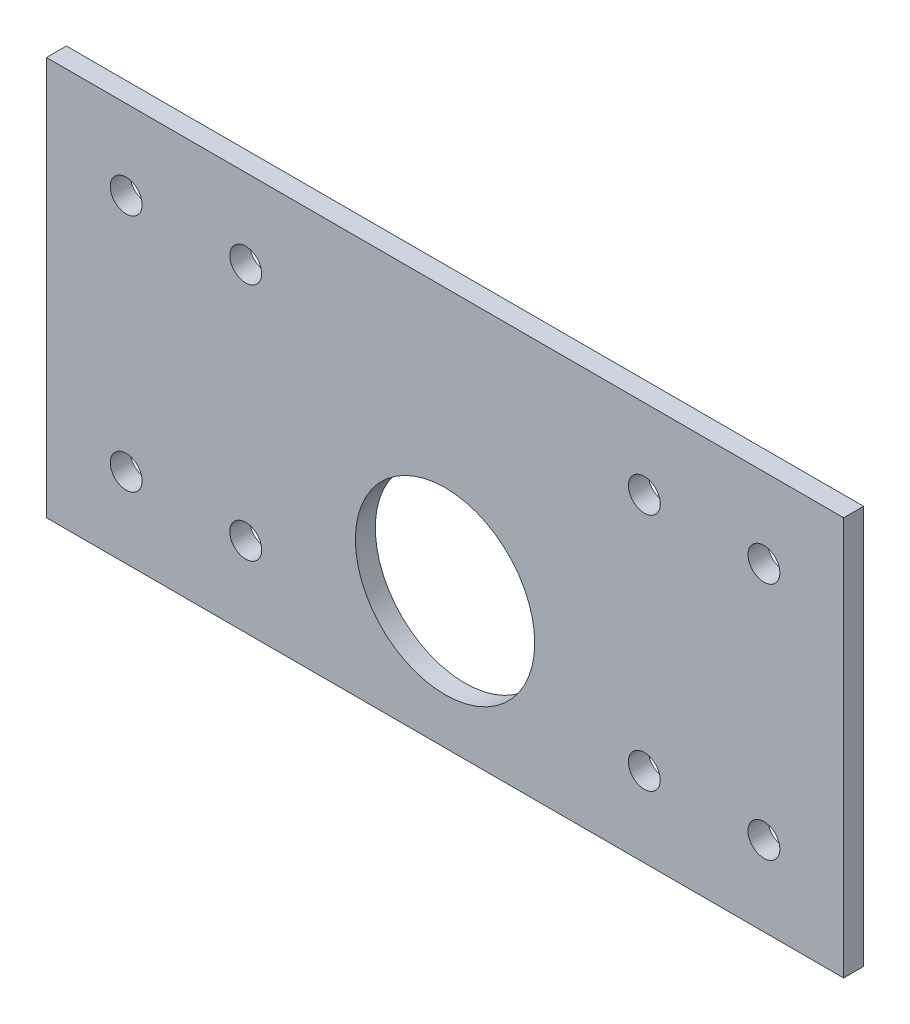
ISO-10303-21;
HEADER;
FILE_DESCRIPTION(('STEP AP214'),'2;1');
FILE_NAME('part.step','',(''),(''),'','','');
FILE_SCHEMA(('AUTOMOTIVE_DESIGN { 1 0 10303 214 1 1 1 1 }'));
ENDSEC;
DATA;
#1=APPLICATION_CONTEXT('core data for automotive mechanical design processes');
#2=APPLICATION_PROTOCOL_DEFINITION('international standard','automotive_design',2000,#1);
#3=PRODUCT_CONTEXT('',#1,'mechanical');
#4=PRODUCT('Part','Part','',(#3));
#5=PRODUCT_RELATED_PRODUCT_CATEGORY('part','',(#4));
#6=PRODUCT_DEFINITION_FORMATION('','',#4);
#7=PRODUCT_DEFINITION_CONTEXT('part definition',#1,'design');
#8=PRODUCT_DEFINITION('design','',#6,#7);
#9=PRODUCT_DEFINITION_SHAPE('','',#8);
#10=(LENGTH_UNIT() NAMED_UNIT(*) SI_UNIT(.MILLI.,.METRE.));
#11=(NAMED_UNIT(*) PLANE_ANGLE_UNIT() SI_UNIT($,.RADIAN.));
#12=(NAMED_UNIT(*) SI_UNIT($,.STERADIAN.) SOLID_ANGLE_UNIT());
#13=UNCERTAINTY_MEASURE_WITH_UNIT(LENGTH_MEASURE(1.E-05),#10,'distance_accuracy_value','');
#14=(GEOMETRIC_REPRESENTATION_CONTEXT(3) GLOBAL_UNCERTAINTY_ASSIGNED_CONTEXT((#13)) GLOBAL_UNIT_ASSIGNED_CONTEXT((#10,
#11,#12)) REPRESENTATION_CONTEXT('',''));
#15=CARTESIAN_POINT('',(0.,0.,0.));
#16=DIRECTION('',(0.,0.,1.));
#17=DIRECTION('',(1.,0.,0.));
#18=AXIS2_PLACEMENT_3D('',#15,#16,#17);
#19=CARTESIAN_POINT('',(63.5,-31.75,1.5875));
#20=DIRECTION('',(-1.,0.,0.));
#21=DIRECTION('',(0.,0.,1.));
#22=AXIS2_PLACEMENT_3D('',#19,#20,#21);
#23=PLANE('',#22);
#24=DIRECTION('',(0.,1.,0.));
#25=VECTOR('',#24,1.);
#26=CARTESIAN_POINT('',(63.5,-31.75,-1.5875));
#27=LINE('',#26,#25);
#28=CARTESIAN_POINT('',(63.5,-31.75,-1.5875));
#29=VERTEX_POINT('',#28);
#30=CARTESIAN_POINT('',(63.5,31.75,-1.5875));
#31=VERTEX_POINT('',#30);
#32=EDGE_CURVE('E115',#29,#31,#27,.T.);
#33=ORIENTED_EDGE('',*,*,#32,.T.);
#34=DIRECTION('',(0.,0.,-1.));
#35=VECTOR('',#34,1.);
#36=CARTESIAN_POINT('',(63.5,31.75,1.5875));
#37=LINE('',#36,#35);
#38=CARTESIAN_POINT('',(63.5,31.75,1.5875));
#39=VERTEX_POINT('',#38);
#40=EDGE_CURVE('E11',#39,#31,#37,.T.);
#41=ORIENTED_EDGE('',*,*,#40,.F.);
#42=DIRECTION('',(0.,1.,0.));
#43=VECTOR('',#42,1.);
#44=CARTESIAN_POINT('',(63.5,-31.75,1.5875));
#45=LINE('',#44,#43);
#46=CARTESIAN_POINT('',(63.5,-31.75,1.5875));
#47=VERTEX_POINT('',#46);
#48=EDGE_CURVE('E98',#47,#39,#45,.T.);
#49=ORIENTED_EDGE('',*,*,#48,.F.);
#50=DIRECTION('',(0.,0.,-1.));
#51=VECTOR('',#50,1.);
#52=CARTESIAN_POINT('',(63.5,-31.75,1.5875));
#53=LINE('',#52,#51);
#54=EDGE_CURVE('E111',#47,#29,#53,.T.);
#55=ORIENTED_EDGE('',*,*,#54,.T.);
#56=EDGE_LOOP('',(#33,#41,#49,#55));
#57=FACE_BOUND('',#56,.T.);
#58=ADVANCED_FACE('F43',(#57),#23,.F.);
#59=CARTESIAN_POINT('',(-63.5,31.75,1.5875));
#60=DIRECTION('',(0.,-1.,0.));
#61=DIRECTION('',(0.,0.,-1.));
#62=AXIS2_PLACEMENT_3D('',#59,#60,#61);
#63=PLANE('',#62);
#64=DIRECTION('',(-1.,0.,0.));
#65=VECTOR('',#64,1.);
#66=CARTESIAN_POINT('',(-63.5,31.75,-1.5875));
#67=LINE('',#66,#65);
#68=CARTESIAN_POINT('',(-63.5,31.75,-1.5875));
#69=VERTEX_POINT('',#68);
#70=EDGE_CURVE('E103',#31,#69,#67,.T.);
#71=ORIENTED_EDGE('',*,*,#70,.T.);
#72=DIRECTION('',(0.,0.,-1.));
#73=VECTOR('',#72,1.);
#74=CARTESIAN_POINT('',(-63.5,31.75,1.5875));
#75=LINE('',#74,#73);
#76=CARTESIAN_POINT('',(-63.5,31.75,1.5875));
#77=VERTEX_POINT('',#76);
#78=EDGE_CURVE('E51',#77,#69,#75,.T.);
#79=ORIENTED_EDGE('',*,*,#78,.F.);
#80=DIRECTION('',(-1.,0.,0.));
#81=VECTOR('',#80,1.);
#82=CARTESIAN_POINT('',(-63.5,31.75,1.5875));
#83=LINE('',#82,#81);
#84=EDGE_CURVE('E93',#39,#77,#83,.T.);
#85=ORIENTED_EDGE('',*,*,#84,.F.);
#86=ORIENTED_EDGE('',*,*,#40,.T.);
#87=EDGE_LOOP('',(#71,#79,#85,#86));
#88=FACE_BOUND('',#87,.T.);
#89=ADVANCED_FACE('F102',(#88),#63,.F.);
#90=CARTESIAN_POINT('',(-63.5,-31.75,1.5875));
#91=DIRECTION('',(1.,0.,0.));
#92=DIRECTION('',(0.,0.,-1.));
#93=AXIS2_PLACEMENT_3D('',#90,#91,#92);
#94=PLANE('',#93);
#95=DIRECTION('',(0.,-1.,0.));
#96=VECTOR('',#95,1.);
#97=CARTESIAN_POINT('',(-63.5,-31.75,-1.5875));
#98=LINE('',#97,#96);
#99=CARTESIAN_POINT('',(-63.5,-31.75,-1.5875));
#100=VERTEX_POINT('',#99);
#101=EDGE_CURVE('E80',#69,#100,#98,.T.);
#102=ORIENTED_EDGE('',*,*,#101,.T.);
#103=DIRECTION('',(0.,0.,-1.));
#104=VECTOR('',#103,1.);
#105=CARTESIAN_POINT('',(-63.5,-31.75,1.5875));
#106=LINE('',#105,#104);
#107=CARTESIAN_POINT('',(-63.5,-31.75,1.5875));
#108=VERTEX_POINT('',#107);
#109=EDGE_CURVE('E104',#108,#100,#106,.T.);
#110=ORIENTED_EDGE('',*,*,#109,.F.);
#111=DIRECTION('',(0.,-1.,0.));
#112=VECTOR('',#111,1.);
#113=CARTESIAN_POINT('',(-63.5,-31.75,1.5875));
#114=LINE('',#113,#112);
#115=EDGE_CURVE('E96',#77,#108,#114,.T.);
#116=ORIENTED_EDGE('',*,*,#115,.F.);
#117=ORIENTED_EDGE('',*,*,#78,.T.);
#118=EDGE_LOOP('',(#102,#110,#116,#117));
#119=FACE_BOUND('',#118,.T.);
#120=ADVANCED_FACE('F105',(#119),#94,.F.);
#121=CARTESIAN_POINT('',(-63.5,-31.75,1.5875));
#122=DIRECTION('',(0.,1.,0.));
#123=DIRECTION('',(0.,0.,1.));
#124=AXIS2_PLACEMENT_3D('',#121,#122,#123);
#125=PLANE('',#124);
#126=DIRECTION('',(1.,0.,0.));
#127=VECTOR('',#126,1.);
#128=CARTESIAN_POINT('',(-63.5,-31.75,-1.5875));
#129=LINE('',#128,#127);
#130=EDGE_CURVE('E86',#100,#29,#129,.T.);
#131=ORIENTED_EDGE('',*,*,#130,.T.);
#132=ORIENTED_EDGE('',*,*,#54,.F.);
#133=DIRECTION('',(1.,0.,0.));
#134=VECTOR('',#133,1.);
#135=CARTESIAN_POINT('',(-63.5,-31.75,1.5875));
#136=LINE('',#135,#134);
#137=EDGE_CURVE('E62',#108,#47,#136,.T.);
#138=ORIENTED_EDGE('',*,*,#137,.F.);
#139=ORIENTED_EDGE('',*,*,#109,.T.);
#140=EDGE_LOOP('',(#131,#132,#138,#139));
#141=FACE_BOUND('',#140,.T.);
#142=ADVANCED_FACE('F130',(#141),#125,.F.);
#143=CARTESIAN_POINT('',(0.,0.,1.5875));
#144=DIRECTION('',(0.,0.,-1.));
#145=DIRECTION('',(-1.,0.,0.));
#146=AXIS2_PLACEMENT_3D('',#143,#144,#145);
#147=PLANE('',#146);
#148=CARTESIAN_POINT('',(-31.75,-19.05,1.5875));
#149=DIRECTION('',(0.,0.,1.));
#150=DIRECTION('',(1.,0.,0.));
#151=AXIS2_PLACEMENT_3D('',#148,#149,#150);
#152=CIRCLE('',#151,2.54000000000003);
#153=CARTESIAN_POINT('',(-29.21,-19.05,1.5875));
#154=VERTEX_POINT('',#153);
#155=EDGE_CURVE('E182',#154,#154,#152,.T.);
#156=ORIENTED_EDGE('',*,*,#155,.F.);
#157=EDGE_LOOP('',(#156));
#158=FACE_BOUND('',#157,.T.);
#159=CARTESIAN_POINT('',(31.75,19.05,1.5875));
#160=DIRECTION('',(0.,0.,1.));
#161=DIRECTION('',(1.,0.,0.));
#162=AXIS2_PLACEMENT_3D('',#159,#160,#161);
#163=CIRCLE('',#162,2.54);
#164=CARTESIAN_POINT('',(34.29,19.05,1.5875));
#165=VERTEX_POINT('',#164);
#166=EDGE_CURVE('E183',#165,#165,#163,.T.);
#167=ORIENTED_EDGE('',*,*,#166,.F.);
#168=EDGE_LOOP('',(#167));
#169=FACE_BOUND('',#168,.T.);
#170=CARTESIAN_POINT('',(31.75,-19.05,1.5875));
#171=DIRECTION('',(0.,0.,1.));
#172=DIRECTION('',(1.,0.,0.));
#173=AXIS2_PLACEMENT_3D('',#170,#171,#172);
#174=CIRCLE('',#173,2.54000000000002);
#175=CARTESIAN_POINT('',(34.29,-19.05,1.5875));
#176=VERTEX_POINT('',#175);
#177=EDGE_CURVE('E197',#176,#176,#174,.T.);
#178=ORIENTED_EDGE('',*,*,#177,.F.);
#179=EDGE_LOOP('',(#178));
#180=FACE_BOUND('',#179,.T.);
#181=CARTESIAN_POINT('',(-31.75,19.05,1.5875));
#182=DIRECTION('',(0.,0.,1.));
#183=DIRECTION('',(1.,0.,0.));
#184=AXIS2_PLACEMENT_3D('',#181,#182,#183);
#185=CIRCLE('',#184,2.54);
#186=CARTESIAN_POINT('',(-29.21,19.05,1.5875));
#187=VERTEX_POINT('',#186);
#188=EDGE_CURVE('E174',#187,#187,#185,.T.);
#189=ORIENTED_EDGE('',*,*,#188,.F.);
#190=EDGE_LOOP('',(#189));
#191=FACE_BOUND('',#190,.T.);
#192=CARTESIAN_POINT('',(50.8,19.05,1.5875));
#193=DIRECTION('',(0.,0.,1.));
#194=DIRECTION('',(1.,0.,0.));
#195=AXIS2_PLACEMENT_3D('',#192,#193,#194);
#196=CIRCLE('',#195,2.54);
#197=CARTESIAN_POINT('',(53.34,19.05,1.5875));
#198=VERTEX_POINT('',#197);
#199=EDGE_CURVE('E154',#198,#198,#196,.T.);
#200=ORIENTED_EDGE('',*,*,#199,.F.);
#201=EDGE_LOOP('',(#200));
#202=FACE_BOUND('',#201,.T.);
#203=CARTESIAN_POINT('',(50.8,-19.05,1.5875));
#204=DIRECTION('',(0.,0.,1.));
#205=DIRECTION('',(1.,0.,0.));
#206=AXIS2_PLACEMENT_3D('',#203,#204,#205);
#207=CIRCLE('',#206,2.54000000000003);
#208=CARTESIAN_POINT('',(53.34,-19.05,1.5875));
#209=VERTEX_POINT('',#208);
#210=EDGE_CURVE('E153',#209,#209,#207,.T.);
#211=ORIENTED_EDGE('',*,*,#210,.F.);
#212=EDGE_LOOP('',(#211));
#213=FACE_BOUND('',#212,.T.);
#214=CARTESIAN_POINT('',(-50.8,-19.05,1.5875));
#215=DIRECTION('',(0.,0.,1.));
#216=DIRECTION('',(1.,0.,0.));
#217=AXIS2_PLACEMENT_3D('',#214,#215,#216);
#218=CIRCLE('',#217,2.54000000000004);
#219=CARTESIAN_POINT('',(-48.26,-19.05,1.5875));
#220=VERTEX_POINT('',#219);
#221=EDGE_CURVE('E161',#220,#220,#218,.T.);
#222=ORIENTED_EDGE('',*,*,#221,.F.);
#223=EDGE_LOOP('',(#222));
#224=FACE_BOUND('',#223,.T.);
#225=CARTESIAN_POINT('',(-50.8,19.05,1.5875));
#226=DIRECTION('',(0.,0.,1.));
#227=DIRECTION('',(1.,0.,0.));
#228=AXIS2_PLACEMENT_3D('',#225,#226,#227);
#229=CIRCLE('',#228,2.54);
#230=CARTESIAN_POINT('',(-48.26,19.05,1.5875));
#231=VERTEX_POINT('',#230);
#232=EDGE_CURVE('E146',#231,#231,#229,.T.);
#233=ORIENTED_EDGE('',*,*,#232,.F.);
#234=EDGE_LOOP('',(#233));
#235=FACE_BOUND('',#234,.T.);
#236=CARTESIAN_POINT('',(0.,-10.125,1.5875));
#237=DIRECTION('',(0.,0.,-1.));
#238=DIRECTION('',(-1.,0.,0.));
#239=AXIS2_PLACEMENT_3D('',#236,#237,#238);
#240=CIRCLE('',#239,14.2875);
#241=CARTESIAN_POINT('',(-14.2875,-10.125,1.5875));
#242=VERTEX_POINT('',#241);
#243=EDGE_CURVE('E119',#242,#242,#240,.T.);
#244=ORIENTED_EDGE('',*,*,#243,.T.);
#245=EDGE_LOOP('',(#244));
#246=FACE_BOUND('',#245,.T.);
#247=ORIENTED_EDGE('',*,*,#48,.T.);
#248=ORIENTED_EDGE('',*,*,#84,.T.);
#249=ORIENTED_EDGE('',*,*,#115,.T.);
#250=ORIENTED_EDGE('',*,*,#137,.T.);
#251=EDGE_LOOP('',(#247,#248,#249,#250));
#252=FACE_BOUND('',#251,.T.);
#253=ADVANCED_FACE('F94',(#158,#169,#180,#191,#202,#213,#224,#235,#246,#252),#147,.F.);
#254=CARTESIAN_POINT('',(0.,0.,-1.5875));
#255=DIRECTION('',(0.,0.,-1.));
#256=DIRECTION('',(-1.,0.,0.));
#257=AXIS2_PLACEMENT_3D('',#254,#255,#256);
#258=PLANE('',#257);
#259=CARTESIAN_POINT('',(-31.75,-19.05,-1.5875));
#260=DIRECTION('',(0.,0.,1.));
#261=DIRECTION('',(1.,0.,0.));
#262=AXIS2_PLACEMENT_3D('',#259,#260,#261);
#263=CIRCLE('',#262,2.54000000000003);
#264=CARTESIAN_POINT('',(-29.21,-19.05,-1.5875));
#265=VERTEX_POINT('',#264);
#266=EDGE_CURVE('E177',#265,#265,#263,.T.);
#267=ORIENTED_EDGE('',*,*,#266,.T.);
#268=EDGE_LOOP('',(#267));
#269=FACE_BOUND('',#268,.T.);
#270=CARTESIAN_POINT('',(31.75,19.05,-1.5875));
#271=DIRECTION('',(0.,0.,1.));
#272=DIRECTION('',(1.,0.,0.));
#273=AXIS2_PLACEMENT_3D('',#270,#271,#272);
#274=CIRCLE('',#273,2.54);
#275=CARTESIAN_POINT('',(34.29,19.05,-1.5875));
#276=VERTEX_POINT('',#275);
#277=EDGE_CURVE('E178',#276,#276,#274,.T.);
#278=ORIENTED_EDGE('',*,*,#277,.T.);
#279=EDGE_LOOP('',(#278));
#280=FACE_BOUND('',#279,.T.);
#281=CARTESIAN_POINT('',(31.75,-19.05,-1.5875));
#282=DIRECTION('',(0.,0.,1.));
#283=DIRECTION('',(1.,0.,0.));
#284=AXIS2_PLACEMENT_3D('',#281,#282,#283);
#285=CIRCLE('',#284,2.54000000000002);
#286=CARTESIAN_POINT('',(34.29,-19.05,-1.5875));
#287=VERTEX_POINT('',#286);
#288=EDGE_CURVE('E187',#287,#287,#285,.T.);
#289=ORIENTED_EDGE('',*,*,#288,.T.);
#290=EDGE_LOOP('',(#289));
#291=FACE_BOUND('',#290,.T.);
#292=CARTESIAN_POINT('',(-31.75,19.05,-1.5875));
#293=DIRECTION('',(0.,0.,1.));
#294=DIRECTION('',(1.,0.,0.));
#295=AXIS2_PLACEMENT_3D('',#292,#293,#294);
#296=CIRCLE('',#295,2.54);
#297=CARTESIAN_POINT('',(-29.21,19.05,-1.5875));
#298=VERTEX_POINT('',#297);
#299=EDGE_CURVE('E157',#298,#298,#296,.T.);
#300=ORIENTED_EDGE('',*,*,#299,.T.);
#301=EDGE_LOOP('',(#300));
#302=FACE_BOUND('',#301,.T.);
#303=CARTESIAN_POINT('',(50.8,19.05,-1.5875));
#304=DIRECTION('',(0.,0.,1.));
#305=DIRECTION('',(1.,0.,0.));
#306=AXIS2_PLACEMENT_3D('',#303,#304,#305);
#307=CIRCLE('',#306,2.54);
#308=CARTESIAN_POINT('',(53.34,19.05,-1.5875));
#309=VERTEX_POINT('',#308);
#310=EDGE_CURVE('E150',#309,#309,#307,.T.);
#311=ORIENTED_EDGE('',*,*,#310,.T.);
#312=EDGE_LOOP('',(#311));
#313=FACE_BOUND('',#312,.T.);
#314=CARTESIAN_POINT('',(50.8,-19.05,-1.5875));
#315=DIRECTION('',(0.,0.,1.));
#316=DIRECTION('',(1.,0.,0.));
#317=AXIS2_PLACEMENT_3D('',#314,#315,#316);
#318=CIRCLE('',#317,2.54000000000003);
#319=CARTESIAN_POINT('',(53.34,-19.05,-1.5875));
#320=VERTEX_POINT('',#319);
#321=EDGE_CURVE('E158',#320,#320,#318,.T.);
#322=ORIENTED_EDGE('',*,*,#321,.T.);
#323=EDGE_LOOP('',(#322));
#324=FACE_BOUND('',#323,.T.);
#325=CARTESIAN_POINT('',(-50.8,-19.05,-1.5875));
#326=DIRECTION('',(0.,0.,1.));
#327=DIRECTION('',(1.,0.,0.));
#328=AXIS2_PLACEMENT_3D('',#325,#326,#327);
#329=CIRCLE('',#328,2.54000000000004);
#330=CARTESIAN_POINT('',(-48.26,-19.05,-1.5875));
#331=VERTEX_POINT('',#330);
#332=EDGE_CURVE('E149',#331,#331,#329,.T.);
#333=ORIENTED_EDGE('',*,*,#332,.T.);
#334=EDGE_LOOP('',(#333));
#335=FACE_BOUND('',#334,.T.);
#336=CARTESIAN_POINT('',(-50.8,19.05,-1.5875));
#337=DIRECTION('',(0.,0.,1.));
#338=DIRECTION('',(1.,0.,0.));
#339=AXIS2_PLACEMENT_3D('',#336,#337,#338);
#340=CIRCLE('',#339,2.54);
#341=CARTESIAN_POINT('',(-48.26,19.05,-1.5875));
#342=VERTEX_POINT('',#341);
#343=EDGE_CURVE('E143',#342,#342,#340,.T.);
#344=ORIENTED_EDGE('',*,*,#343,.T.);
#345=EDGE_LOOP('',(#344));
#346=FACE_BOUND('',#345,.T.);
#347=CARTESIAN_POINT('',(0.,-10.125,-1.5875));
#348=DIRECTION('',(0.,0.,1.));
#349=DIRECTION('',(1.,0.,0.));
#350=AXIS2_PLACEMENT_3D('',#347,#348,#349);
#351=CIRCLE('',#350,14.2875);
#352=CARTESIAN_POINT('',(14.2875,-10.125,-1.5875));
#353=VERTEX_POINT('',#352);
#354=EDGE_CURVE('E139',#353,#353,#351,.T.);
#355=ORIENTED_EDGE('',*,*,#354,.T.);
#356=EDGE_LOOP('',(#355));
#357=FACE_BOUND('',#356,.T.);
#358=ORIENTED_EDGE('',*,*,#32,.F.);
#359=ORIENTED_EDGE('',*,*,#130,.F.);
#360=ORIENTED_EDGE('',*,*,#101,.F.);
#361=ORIENTED_EDGE('',*,*,#70,.F.);
#362=EDGE_LOOP('',(#358,#359,#360,#361));
#363=FACE_BOUND('',#362,.T.);
#364=ADVANCED_FACE('F133',(#269,#280,#291,#302,#313,#324,#335,#346,#357,#363),#258,.T.);
#365=CARTESIAN_POINT('',(0.,-10.125,-1.5875));
#366=DIRECTION('',(0.,0.,1.));
#367=DIRECTION('',(1.,0.,0.));
#368=AXIS2_PLACEMENT_3D('',#365,#366,#367);
#369=CYLINDRICAL_SURFACE('',#368,14.2875);
#370=ORIENTED_EDGE('',*,*,#354,.F.);
#371=EDGE_LOOP('',(#370));
#372=FACE_BOUND('',#371,.T.);
#373=ORIENTED_EDGE('',*,*,#243,.F.);
#374=EDGE_LOOP('',(#373));
#375=FACE_BOUND('',#374,.T.);
#376=ADVANCED_FACE('F220',(#372,#375),#369,.F.);
#377=CARTESIAN_POINT('',(-50.8,19.05,-1.5875));
#378=DIRECTION('',(0.,0.,1.));
#379=DIRECTION('',(1.,0.,0.));
#380=AXIS2_PLACEMENT_3D('',#377,#378,#379);
#381=CYLINDRICAL_SURFACE('',#380,2.54);
#382=ORIENTED_EDGE('',*,*,#343,.F.);
#383=EDGE_LOOP('',(#382));
#384=FACE_BOUND('',#383,.T.);
#385=ORIENTED_EDGE('',*,*,#232,.T.);
#386=EDGE_LOOP('',(#385));
#387=FACE_BOUND('',#386,.T.);
#388=ADVANCED_FACE('F222',(#384,#387),#381,.F.);
#389=CARTESIAN_POINT('',(-50.8,-19.05,-1.5875));
#390=DIRECTION('',(0.,0.,1.));
#391=DIRECTION('',(1.,0.,0.));
#392=AXIS2_PLACEMENT_3D('',#389,#390,#391);
#393=CYLINDRICAL_SURFACE('',#392,2.54000000000004);
#394=ORIENTED_EDGE('',*,*,#332,.F.);
#395=EDGE_LOOP('',(#394));
#396=FACE_BOUND('',#395,.T.);
#397=ORIENTED_EDGE('',*,*,#221,.T.);
#398=EDGE_LOOP('',(#397));
#399=FACE_BOUND('',#398,.T.);
#400=ADVANCED_FACE('F229',(#396,#399),#393,.F.);
#401=CARTESIAN_POINT('',(50.8,-19.05,-1.5875));
#402=DIRECTION('',(0.,0.,1.));
#403=DIRECTION('',(1.,0.,0.));
#404=AXIS2_PLACEMENT_3D('',#401,#402,#403);
#405=CYLINDRICAL_SURFACE('',#404,2.54000000000003);
#406=ORIENTED_EDGE('',*,*,#321,.F.);
#407=EDGE_LOOP('',(#406));
#408=FACE_BOUND('',#407,.T.);
#409=ORIENTED_EDGE('',*,*,#210,.T.);
#410=EDGE_LOOP('',(#409));
#411=FACE_BOUND('',#410,.T.);
#412=ADVANCED_FACE('F315',(#408,#411),#405,.F.);
#413=CARTESIAN_POINT('',(50.8,19.05,-1.5875));
#414=DIRECTION('',(0.,0.,1.));
#415=DIRECTION('',(1.,0.,0.));
#416=AXIS2_PLACEMENT_3D('',#413,#414,#415);
#417=CYLINDRICAL_SURFACE('',#416,2.54);
#418=ORIENTED_EDGE('',*,*,#310,.F.);
#419=EDGE_LOOP('',(#418));
#420=FACE_BOUND('',#419,.T.);
#421=ORIENTED_EDGE('',*,*,#199,.T.);
#422=EDGE_LOOP('',(#421));
#423=FACE_BOUND('',#422,.T.);
#424=ADVANCED_FACE('F274',(#420,#423),#417,.F.);
#425=CARTESIAN_POINT('',(-31.75,19.05,-1.5875));
#426=DIRECTION('',(0.,0.,1.));
#427=DIRECTION('',(1.,0.,0.));
#428=AXIS2_PLACEMENT_3D('',#425,#426,#427);
#429=CYLINDRICAL_SURFACE('',#428,2.54);
#430=ORIENTED_EDGE('',*,*,#299,.F.);
#431=EDGE_LOOP('',(#430));
#432=FACE_BOUND('',#431,.T.);
#433=ORIENTED_EDGE('',*,*,#188,.T.);
#434=EDGE_LOOP('',(#433));
#435=FACE_BOUND('',#434,.T.);
#436=ADVANCED_FACE('F269',(#432,#435),#429,.F.);
#437=CARTESIAN_POINT('',(31.75,-19.05,-1.5875));
#438=DIRECTION('',(0.,0.,1.));
#439=DIRECTION('',(1.,0.,0.));
#440=AXIS2_PLACEMENT_3D('',#437,#438,#439);
#441=CYLINDRICAL_SURFACE('',#440,2.54000000000002);
#442=ORIENTED_EDGE('',*,*,#288,.F.);
#443=EDGE_LOOP('',(#442));
#444=FACE_BOUND('',#443,.T.);
#445=ORIENTED_EDGE('',*,*,#177,.T.);
#446=EDGE_LOOP('',(#445));
#447=FACE_BOUND('',#446,.T.);
#448=ADVANCED_FACE('F202',(#444,#447),#441,.F.);
#449=CARTESIAN_POINT('',(31.75,19.05,-1.5875));
#450=DIRECTION('',(0.,0.,1.));
#451=DIRECTION('',(1.,0.,0.));
#452=AXIS2_PLACEMENT_3D('',#449,#450,#451);
#453=CYLINDRICAL_SURFACE('',#452,2.54);
#454=ORIENTED_EDGE('',*,*,#277,.F.);
#455=EDGE_LOOP('',(#454));
#456=FACE_BOUND('',#455,.T.);
#457=ORIENTED_EDGE('',*,*,#166,.T.);
#458=EDGE_LOOP('',(#457));
#459=FACE_BOUND('',#458,.T.);
#460=ADVANCED_FACE('F286',(#456,#459),#453,.F.);
#461=CARTESIAN_POINT('',(-31.75,-19.05,-1.5875));
#462=DIRECTION('',(0.,0.,1.));
#463=DIRECTION('',(1.,0.,0.));
#464=AXIS2_PLACEMENT_3D('',#461,#462,#463);
#465=CYLINDRICAL_SURFACE('',#464,2.54000000000003);
#466=ORIENTED_EDGE('',*,*,#266,.F.);
#467=EDGE_LOOP('',(#466));
#468=FACE_BOUND('',#467,.T.);
#469=ORIENTED_EDGE('',*,*,#155,.T.);
#470=EDGE_LOOP('',(#469));
#471=FACE_BOUND('',#470,.T.);
#472=ADVANCED_FACE('F296',(#468,#471),#465,.F.);
#473=CLOSED_SHELL('',(#58,#89,#120,#142,#253,#364,#376,#388,#400,#412,#424,#436,#448,#460,#472));
#474=MANIFOLD_SOLID_BREP('B2',#473);
#475=ADVANCED_BREP_SHAPE_REPRESENTATION('',(#18,#474),#14);
#476=SHAPE_DEFINITION_REPRESENTATION(#9,#475);
ENDSEC;
END-ISO-10303-21;
